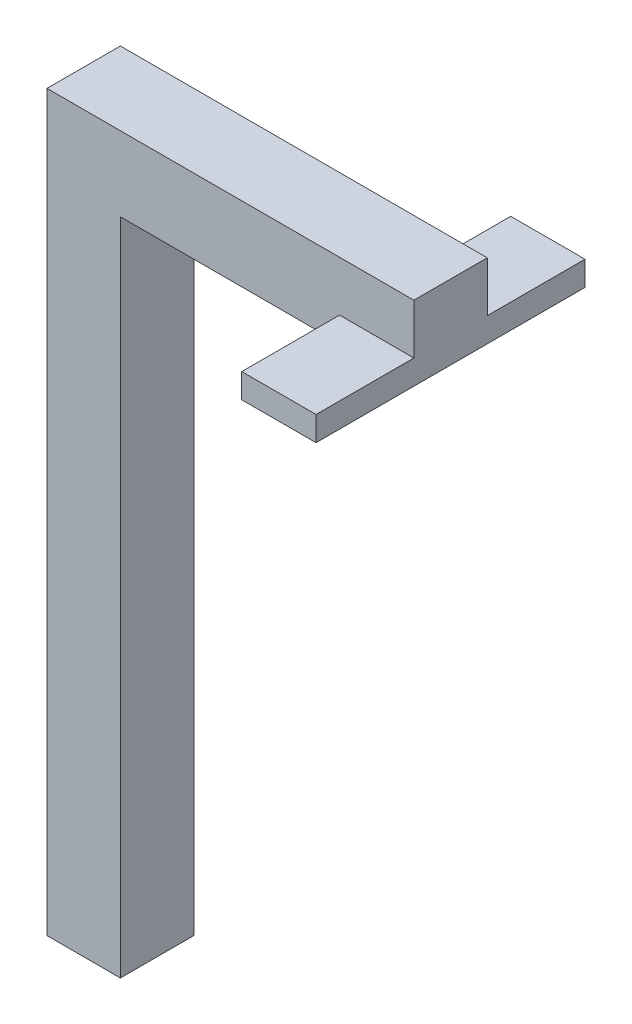
ISO-10303-21;
HEADER;
FILE_DESCRIPTION(('STEP AP214'),'2;1');
FILE_NAME('part.step','',(''),(''),'','','');
FILE_SCHEMA(('AUTOMOTIVE_DESIGN { 1 0 10303 214 1 1 1 1 }'));
ENDSEC;
DATA;
#1=APPLICATION_CONTEXT('core data for automotive mechanical design processes');
#2=APPLICATION_PROTOCOL_DEFINITION('international standard','automotive_design',2000,#1);
#3=PRODUCT_CONTEXT('',#1,'mechanical');
#4=PRODUCT('Part','Part','',(#3));
#5=PRODUCT_RELATED_PRODUCT_CATEGORY('part','',(#4));
#6=PRODUCT_DEFINITION_FORMATION('','',#4);
#7=PRODUCT_DEFINITION_CONTEXT('part definition',#1,'design');
#8=PRODUCT_DEFINITION('design','',#6,#7);
#9=PRODUCT_DEFINITION_SHAPE('','',#8);
#10=(LENGTH_UNIT() NAMED_UNIT(*) SI_UNIT(.MILLI.,.METRE.));
#11=(NAMED_UNIT(*) PLANE_ANGLE_UNIT() SI_UNIT($,.RADIAN.));
#12=(NAMED_UNIT(*) SI_UNIT($,.STERADIAN.) SOLID_ANGLE_UNIT());
#13=UNCERTAINTY_MEASURE_WITH_UNIT(LENGTH_MEASURE(1.E-05),#10,'distance_accuracy_value','');
#14=(GEOMETRIC_REPRESENTATION_CONTEXT(3) GLOBAL_UNCERTAINTY_ASSIGNED_CONTEXT((#13)) GLOBAL_UNIT_ASSIGNED_CONTEXT((#10,
#11,#12)) REPRESENTATION_CONTEXT('',''));
#15=CARTESIAN_POINT('',(0.,0.,0.));
#16=DIRECTION('',(0.,0.,1.));
#17=DIRECTION('',(1.,0.,0.));
#18=AXIS2_PLACEMENT_3D('',#15,#16,#17);
#19=CARTESIAN_POINT('',(7.62,0.,7.62));
#20=DIRECTION('',(-1.,0.,0.));
#21=DIRECTION('',(0.,0.,1.));
#22=AXIS2_PLACEMENT_3D('',#19,#20,#21);
#23=PLANE('',#22);
#24=DIRECTION('',(0.,0.,-1.));
#25=VECTOR('',#24,1.);
#26=CARTESIAN_POINT('',(7.62,68.4598354175392,0.));
#27=LINE('',#26,#25);
#28=CARTESIAN_POINT('',(7.62,68.4598354175391,7.62));
#29=VERTEX_POINT('',#28);
#30=CARTESIAN_POINT('',(7.62,68.4598354175392,0.));
#31=VERTEX_POINT('',#30);
#32=EDGE_CURVE('E182',#29,#31,#27,.T.);
#33=ORIENTED_EDGE('',*,*,#32,.F.);
#34=DIRECTION('',(0.,1.,0.));
#35=VECTOR('',#34,1.);
#36=CARTESIAN_POINT('',(7.62,0.,7.62));
#37=LINE('',#36,#35);
#38=CARTESIAN_POINT('',(7.62,0.,7.62));
#39=VERTEX_POINT('',#38);
#40=EDGE_CURVE('E203',#39,#29,#37,.T.);
#41=ORIENTED_EDGE('',*,*,#40,.F.);
#42=DIRECTION('',(0.,0.,-1.));
#43=VECTOR('',#42,1.);
#44=CARTESIAN_POINT('',(7.62,0.,7.62));
#45=LINE('',#44,#43);
#46=CARTESIAN_POINT('',(7.62,0.,0.));
#47=VERTEX_POINT('',#46);
#48=EDGE_CURVE('E47',#39,#47,#45,.T.);
#49=ORIENTED_EDGE('',*,*,#48,.T.);
#50=DIRECTION('',(0.,1.,0.));
#51=VECTOR('',#50,1.);
#52=CARTESIAN_POINT('',(7.62,0.,0.));
#53=LINE('',#52,#51);
#54=EDGE_CURVE('E213',#47,#31,#53,.T.);
#55=ORIENTED_EDGE('',*,*,#54,.T.);
#56=EDGE_LOOP('',(#33,#41,#49,#55));
#57=FACE_BOUND('',#56,.T.);
#58=ADVANCED_FACE('F39',(#57),#23,.F.);
#59=CARTESIAN_POINT('',(0.,76.2,7.62));
#60=DIRECTION('',(1.,0.,0.));
#61=DIRECTION('',(0.,0.,-1.));
#62=AXIS2_PLACEMENT_3D('',#59,#60,#61);
#63=PLANE('',#62);
#64=DIRECTION('',(0.,-1.,0.));
#65=VECTOR('',#64,1.);
#66=CARTESIAN_POINT('',(0.,76.2,0.));
#67=LINE('',#66,#65);
#68=CARTESIAN_POINT('',(0.,76.2,0.));
#69=VERTEX_POINT('',#68);
#70=CARTESIAN_POINT('',(0.,0.,0.));
#71=VERTEX_POINT('',#70);
#72=EDGE_CURVE('E196',#69,#71,#67,.T.);
#73=ORIENTED_EDGE('',*,*,#72,.T.);
#74=DIRECTION('',(0.,0.,-1.));
#75=VECTOR('',#74,1.);
#76=CARTESIAN_POINT('',(0.,0.,7.62));
#77=LINE('',#76,#75);
#78=CARTESIAN_POINT('',(0.,0.,7.62));
#79=VERTEX_POINT('',#78);
#80=EDGE_CURVE('E11',#79,#71,#77,.T.);
#81=ORIENTED_EDGE('',*,*,#80,.F.);
#82=DIRECTION('',(0.,-1.,0.));
#83=VECTOR('',#82,1.);
#84=CARTESIAN_POINT('',(0.,76.2,7.62));
#85=LINE('',#84,#83);
#86=CARTESIAN_POINT('',(0.,76.2,7.62));
#87=VERTEX_POINT('',#86);
#88=EDGE_CURVE('E197',#87,#79,#85,.T.);
#89=ORIENTED_EDGE('',*,*,#88,.F.);
#90=DIRECTION('',(0.,0.,-1.));
#91=VECTOR('',#90,1.);
#92=CARTESIAN_POINT('',(0.,76.2,7.62));
#93=LINE('',#92,#91);
#94=EDGE_CURVE('E208',#87,#69,#93,.T.);
#95=ORIENTED_EDGE('',*,*,#94,.T.);
#96=EDGE_LOOP('',(#73,#81,#89,#95));
#97=FACE_BOUND('',#96,.T.);
#98=ADVANCED_FACE('F41',(#97),#63,.F.);
#99=CARTESIAN_POINT('',(0.,0.,7.62));
#100=DIRECTION('',(0.,1.,0.));
#101=DIRECTION('',(0.,0.,1.));
#102=AXIS2_PLACEMENT_3D('',#99,#100,#101);
#103=PLANE('',#102);
#104=DIRECTION('',(1.,0.,0.));
#105=VECTOR('',#104,1.);
#106=CARTESIAN_POINT('',(0.,0.,0.));
#107=LINE('',#106,#105);
#108=EDGE_CURVE('E211',#71,#47,#107,.T.);
#109=ORIENTED_EDGE('',*,*,#108,.T.);
#110=ORIENTED_EDGE('',*,*,#48,.F.);
#111=DIRECTION('',(1.,0.,0.));
#112=VECTOR('',#111,1.);
#113=CARTESIAN_POINT('',(0.,0.,7.62));
#114=LINE('',#113,#112);
#115=EDGE_CURVE('E200',#79,#39,#114,.T.);
#116=ORIENTED_EDGE('',*,*,#115,.F.);
#117=ORIENTED_EDGE('',*,*,#80,.T.);
#118=EDGE_LOOP('',(#109,#110,#116,#117));
#119=FACE_BOUND('',#118,.T.);
#120=ADVANCED_FACE('F235',(#119),#103,.F.);
#121=CARTESIAN_POINT('',(7.62,76.2,7.62));
#122=DIRECTION('',(0.,-1.,0.));
#123=DIRECTION('',(0.,0.,-1.));
#124=AXIS2_PLACEMENT_3D('',#121,#122,#123);
#125=PLANE('',#124);
#126=DIRECTION('',(-1.,0.,0.));
#127=VECTOR('',#126,1.);
#128=CARTESIAN_POINT('',(7.62,76.2,0.));
#129=LINE('',#128,#127);
#130=CARTESIAN_POINT('',(38.1,76.2,0.));
#131=VERTEX_POINT('',#130);
#132=EDGE_CURVE('E201',#131,#69,#129,.T.);
#133=ORIENTED_EDGE('',*,*,#132,.T.);
#134=ORIENTED_EDGE('',*,*,#94,.F.);
#135=DIRECTION('',(-1.,0.,0.));
#136=VECTOR('',#135,1.);
#137=CARTESIAN_POINT('',(7.62,76.2,7.62));
#138=LINE('',#137,#136);
#139=CARTESIAN_POINT('',(38.1,76.2,7.62));
#140=VERTEX_POINT('',#139);
#141=EDGE_CURVE('E206',#140,#87,#138,.T.);
#142=ORIENTED_EDGE('',*,*,#141,.F.);
#143=DIRECTION('',(0.,0.,1.));
#144=VECTOR('',#143,1.);
#145=CARTESIAN_POINT('',(38.1,76.2,7.62));
#146=LINE('',#145,#144);
#147=EDGE_CURVE('E183',#131,#140,#146,.T.);
#148=ORIENTED_EDGE('',*,*,#147,.F.);
#149=EDGE_LOOP('',(#133,#134,#142,#148));
#150=FACE_BOUND('',#149,.T.);
#151=ADVANCED_FACE('F241',(#150),#125,.F.);
#152=CARTESIAN_POINT('',(0.,0.,7.62));
#153=DIRECTION('',(0.,0.,1.));
#154=DIRECTION('',(1.,0.,0.));
#155=AXIS2_PLACEMENT_3D('',#152,#153,#154);
#156=PLANE('',#155);
#157=DIRECTION('',(0.,-1.,0.));
#158=VECTOR('',#157,1.);
#159=CARTESIAN_POINT('',(30.3825770628841,0.,7.62));
#160=LINE('',#159,#158);
#161=CARTESIAN_POINT('',(30.3825770628841,70.9998354175392,7.62));
#162=VERTEX_POINT('',#161);
#163=CARTESIAN_POINT('',(30.3825770628841,68.4598354175392,7.62));
#164=VERTEX_POINT('',#163);
#165=EDGE_CURVE('E180',#162,#164,#160,.T.);
#166=ORIENTED_EDGE('',*,*,#165,.F.);
#167=DIRECTION('',(-1.,0.,0.));
#168=VECTOR('',#167,1.);
#169=CARTESIAN_POINT('',(0.,70.9998354175392,7.62));
#170=LINE('',#169,#168);
#171=CARTESIAN_POINT('',(38.1,70.9998354175392,7.62));
#172=VERTEX_POINT('',#171);
#173=EDGE_CURVE('E176',#172,#162,#170,.T.);
#174=ORIENTED_EDGE('',*,*,#173,.F.);
#175=DIRECTION('',(0.,-1.,0.));
#176=VECTOR('',#175,1.);
#177=CARTESIAN_POINT('',(38.1,68.4598354175392,7.62));
#178=LINE('',#177,#176);
#179=EDGE_CURVE('E137',#140,#172,#178,.T.);
#180=ORIENTED_EDGE('',*,*,#179,.F.);
#181=ORIENTED_EDGE('',*,*,#141,.T.);
#182=ORIENTED_EDGE('',*,*,#88,.T.);
#183=ORIENTED_EDGE('',*,*,#115,.T.);
#184=ORIENTED_EDGE('',*,*,#40,.T.);
#185=DIRECTION('',(-1.,0.,0.));
#186=VECTOR('',#185,1.);
#187=CARTESIAN_POINT('',(38.1,68.4598354175392,7.62));
#188=LINE('',#187,#186);
#189=EDGE_CURVE('E194',#164,#29,#188,.T.);
#190=ORIENTED_EDGE('',*,*,#189,.F.);
#191=EDGE_LOOP('',(#166,#174,#180,#181,#182,#183,#184,#190));
#192=FACE_BOUND('',#191,.T.);
#193=ADVANCED_FACE('F232',(#192),#156,.T.);
#194=CARTESIAN_POINT('',(0.,0.,0.));
#195=DIRECTION('',(0.,0.,1.));
#196=DIRECTION('',(1.,0.,0.));
#197=AXIS2_PLACEMENT_3D('',#194,#195,#196);
#198=PLANE('',#197);
#199=DIRECTION('',(-1.,0.,0.));
#200=VECTOR('',#199,1.);
#201=CARTESIAN_POINT('',(0.,70.9998354175392,0.));
#202=LINE('',#201,#200);
#203=CARTESIAN_POINT('',(38.1,70.9998354175392,0.));
#204=VERTEX_POINT('',#203);
#205=CARTESIAN_POINT('',(30.3825770628841,70.9998354175392,0.));
#206=VERTEX_POINT('',#205);
#207=EDGE_CURVE('E54',#204,#206,#202,.T.);
#208=ORIENTED_EDGE('',*,*,#207,.T.);
#209=DIRECTION('',(0.,-1.,0.));
#210=VECTOR('',#209,1.);
#211=CARTESIAN_POINT('',(30.3825770628841,0.,0.));
#212=LINE('',#211,#210);
#213=CARTESIAN_POINT('',(30.3825770628841,68.4598354175392,0.));
#214=VERTEX_POINT('',#213);
#215=EDGE_CURVE('E178',#206,#214,#212,.T.);
#216=ORIENTED_EDGE('',*,*,#215,.T.);
#217=DIRECTION('',(-1.,0.,0.));
#218=VECTOR('',#217,1.);
#219=CARTESIAN_POINT('',(38.1,68.4598354175392,0.));
#220=LINE('',#219,#218);
#221=EDGE_CURVE('E190',#214,#31,#220,.T.);
#222=ORIENTED_EDGE('',*,*,#221,.T.);
#223=ORIENTED_EDGE('',*,*,#54,.F.);
#224=ORIENTED_EDGE('',*,*,#108,.F.);
#225=ORIENTED_EDGE('',*,*,#72,.F.);
#226=ORIENTED_EDGE('',*,*,#132,.F.);
#227=DIRECTION('',(0.,1.,0.));
#228=VECTOR('',#227,1.);
#229=CARTESIAN_POINT('',(38.1,76.2,0.));
#230=LINE('',#229,#228);
#231=EDGE_CURVE('E188',#204,#131,#230,.T.);
#232=ORIENTED_EDGE('',*,*,#231,.F.);
#233=EDGE_LOOP('',(#208,#216,#222,#223,#224,#225,#226,#232));
#234=FACE_BOUND('',#233,.T.);
#235=ADVANCED_FACE('F225',(#234),#198,.F.);
#236=CARTESIAN_POINT('',(38.1,68.4598354175392,0.));
#237=DIRECTION('',(0.,1.,0.));
#238=DIRECTION('',(0.,0.,1.));
#239=AXIS2_PLACEMENT_3D('',#236,#237,#238);
#240=PLANE('',#239);
#241=ORIENTED_EDGE('',*,*,#221,.F.);
#242=DIRECTION('',(0.,0.,-1.));
#243=VECTOR('',#242,1.);
#244=CARTESIAN_POINT('',(30.3825770628841,68.4598354175392,-10.1506554041903));
#245=LINE('',#244,#243);
#246=CARTESIAN_POINT('',(30.3825770628841,68.4598354175392,-10.1506554041903));
#247=VERTEX_POINT('',#246);
#248=EDGE_CURVE('E164',#214,#247,#245,.T.);
#249=ORIENTED_EDGE('',*,*,#248,.T.);
#250=DIRECTION('',(1.,0.,0.));
#251=VECTOR('',#250,1.);
#252=CARTESIAN_POINT('',(38.1,68.4598354175392,-10.1506554041903));
#253=LINE('',#252,#251);
#254=CARTESIAN_POINT('',(38.1,68.4598354175392,-10.1506554041903));
#255=VERTEX_POINT('',#254);
#256=EDGE_CURVE('E142',#247,#255,#253,.T.);
#257=ORIENTED_EDGE('',*,*,#256,.T.);
#258=DIRECTION('',(0.,0.,-1.));
#259=VECTOR('',#258,1.);
#260=CARTESIAN_POINT('',(38.1,68.4598354175392,0.));
#261=LINE('',#260,#259);
#262=CARTESIAN_POINT('',(38.1,68.4598354175392,17.78));
#263=VERTEX_POINT('',#262);
#264=EDGE_CURVE('E186',#263,#255,#261,.T.);
#265=ORIENTED_EDGE('',*,*,#264,.F.);
#266=DIRECTION('',(-1.,0.,0.));
#267=VECTOR('',#266,1.);
#268=CARTESIAN_POINT('',(30.3825770628841,68.4598354175392,17.78));
#269=LINE('',#268,#267);
#270=CARTESIAN_POINT('',(30.3825770628841,68.4598354175392,17.78));
#271=VERTEX_POINT('',#270);
#272=EDGE_CURVE('E148',#263,#271,#269,.T.);
#273=ORIENTED_EDGE('',*,*,#272,.T.);
#274=EDGE_CURVE('E62',#271,#164,#245,.T.);
#275=ORIENTED_EDGE('',*,*,#274,.T.);
#276=ORIENTED_EDGE('',*,*,#189,.T.);
#277=ORIENTED_EDGE('',*,*,#32,.T.);
#278=EDGE_LOOP('',(#241,#249,#257,#265,#273,#275,#276,#277));
#279=FACE_BOUND('',#278,.T.);
#280=ADVANCED_FACE('F228',(#279),#240,.F.);
#281=CARTESIAN_POINT('',(38.1,0.,0.));
#282=DIRECTION('',(-1.,0.,0.));
#283=DIRECTION('',(0.,0.,1.));
#284=AXIS2_PLACEMENT_3D('',#281,#282,#283);
#285=PLANE('',#284);
#286=ORIENTED_EDGE('',*,*,#179,.T.);
#287=DIRECTION('',(0.,0.,1.));
#288=VECTOR('',#287,1.);
#289=CARTESIAN_POINT('',(38.1,70.9998354175392,7.62));
#290=LINE('',#289,#288);
#291=CARTESIAN_POINT('',(38.1,70.9998354175392,17.78));
#292=VERTEX_POINT('',#291);
#293=EDGE_CURVE('E130',#172,#292,#290,.T.);
#294=ORIENTED_EDGE('',*,*,#293,.T.);
#295=DIRECTION('',(0.,-1.,0.));
#296=VECTOR('',#295,1.);
#297=CARTESIAN_POINT('',(38.1,70.9998354175392,17.78));
#298=LINE('',#297,#296);
#299=EDGE_CURVE('E133',#292,#263,#298,.T.);
#300=ORIENTED_EDGE('',*,*,#299,.T.);
#301=ORIENTED_EDGE('',*,*,#264,.T.);
#302=DIRECTION('',(0.,-1.,0.));
#303=VECTOR('',#302,1.);
#304=CARTESIAN_POINT('',(38.1,70.9998354175392,-10.1506554041903));
#305=LINE('',#304,#303);
#306=CARTESIAN_POINT('',(38.1,70.9998354175392,-10.1506554041903));
#307=VERTEX_POINT('',#306);
#308=EDGE_CURVE('E168',#307,#255,#305,.T.);
#309=ORIENTED_EDGE('',*,*,#308,.F.);
#310=EDGE_CURVE('E141',#307,#204,#290,.T.);
#311=ORIENTED_EDGE('',*,*,#310,.T.);
#312=ORIENTED_EDGE('',*,*,#231,.T.);
#313=ORIENTED_EDGE('',*,*,#147,.T.);
#314=EDGE_LOOP('',(#286,#294,#300,#301,#309,#311,#312,#313));
#315=FACE_BOUND('',#314,.T.);
#316=ADVANCED_FACE('F132',(#315),#285,.F.);
#317=CARTESIAN_POINT('',(38.1,70.9998354175392,-10.1506554041903));
#318=DIRECTION('',(0.,0.,-1.));
#319=DIRECTION('',(0.,1.,0.));
#320=AXIS2_PLACEMENT_3D('',#317,#318,#319);
#321=PLANE('',#320);
#322=ORIENTED_EDGE('',*,*,#256,.F.);
#323=DIRECTION('',(0.,-1.,0.));
#324=VECTOR('',#323,1.);
#325=CARTESIAN_POINT('',(30.3825770628841,70.9998354175392,-10.1506554041903));
#326=LINE('',#325,#324);
#327=CARTESIAN_POINT('',(30.3825770628841,70.9998354175392,-10.1506554041903));
#328=VERTEX_POINT('',#327);
#329=EDGE_CURVE('E171',#328,#247,#326,.T.);
#330=ORIENTED_EDGE('',*,*,#329,.F.);
#331=DIRECTION('',(1.,0.,0.));
#332=VECTOR('',#331,1.);
#333=CARTESIAN_POINT('',(38.1,70.9998354175392,-10.1506554041903));
#334=LINE('',#333,#332);
#335=EDGE_CURVE('E150',#328,#307,#334,.T.);
#336=ORIENTED_EDGE('',*,*,#335,.T.);
#337=ORIENTED_EDGE('',*,*,#308,.T.);
#338=EDGE_LOOP('',(#322,#330,#336,#337));
#339=FACE_BOUND('',#338,.T.);
#340=ADVANCED_FACE('F252',(#339),#321,.T.);
#341=CARTESIAN_POINT('',(0.,70.9998354175392,1.29307171957265E-13));
#342=DIRECTION('',(0.,1.,0.));
#343=DIRECTION('',(0.,0.,1.));
#344=AXIS2_PLACEMENT_3D('',#341,#342,#343);
#345=PLANE('',#344);
#346=ORIENTED_EDGE('',*,*,#207,.F.);
#347=ORIENTED_EDGE('',*,*,#310,.F.);
#348=ORIENTED_EDGE('',*,*,#335,.F.);
#349=DIRECTION('',(0.,0.,-1.));
#350=VECTOR('',#349,1.);
#351=CARTESIAN_POINT('',(30.3825770628841,70.9998354175392,-10.1506554041903));
#352=LINE('',#351,#350);
#353=EDGE_CURVE('E156',#206,#328,#352,.T.);
#354=ORIENTED_EDGE('',*,*,#353,.F.);
#355=EDGE_LOOP('',(#346,#347,#348,#354));
#356=FACE_BOUND('',#355,.T.);
#357=ADVANCED_FACE('F245',(#356),#345,.T.);
#358=CARTESIAN_POINT('',(30.3825770628841,70.9998354175392,-10.1506554041903));
#359=DIRECTION('',(-1.,0.,0.));
#360=DIRECTION('',(0.,0.,1.));
#361=AXIS2_PLACEMENT_3D('',#358,#359,#360);
#362=PLANE('',#361);
#363=ORIENTED_EDGE('',*,*,#215,.F.);
#364=ORIENTED_EDGE('',*,*,#353,.T.);
#365=ORIENTED_EDGE('',*,*,#329,.T.);
#366=ORIENTED_EDGE('',*,*,#248,.F.);
#367=EDGE_LOOP('',(#363,#364,#365,#366));
#368=FACE_BOUND('',#367,.T.);
#369=ADVANCED_FACE('F249',(#368),#362,.T.);
#370=CARTESIAN_POINT('',(30.3825770628841,70.9998354175392,17.78));
#371=VERTEX_POINT('',#370);
#372=EDGE_CURVE('E155',#371,#162,#352,.T.);
#373=ORIENTED_EDGE('',*,*,#372,.T.);
#374=ORIENTED_EDGE('',*,*,#165,.T.);
#375=ORIENTED_EDGE('',*,*,#274,.F.);
#376=DIRECTION('',(0.,-1.,0.));
#377=VECTOR('',#376,1.);
#378=CARTESIAN_POINT('',(30.3825770628841,70.9998354175392,17.78));
#379=LINE('',#378,#377);
#380=EDGE_CURVE('E149',#371,#271,#379,.T.);
#381=ORIENTED_EDGE('',*,*,#380,.F.);
#382=EDGE_LOOP('',(#373,#374,#375,#381));
#383=FACE_BOUND('',#382,.T.);
#384=ADVANCED_FACE('F284',(#383),#362,.T.);
#385=CARTESIAN_POINT('',(30.3825770628841,70.9998354175392,17.78));
#386=DIRECTION('',(0.,0.,1.));
#387=DIRECTION('',(0.,-1.,0.));
#388=AXIS2_PLACEMENT_3D('',#385,#386,#387);
#389=PLANE('',#388);
#390=ORIENTED_EDGE('',*,*,#272,.F.);
#391=ORIENTED_EDGE('',*,*,#299,.F.);
#392=DIRECTION('',(-1.,0.,0.));
#393=VECTOR('',#392,1.);
#394=CARTESIAN_POINT('',(30.3825770628841,70.9998354175392,17.78));
#395=LINE('',#394,#393);
#396=EDGE_CURVE('E147',#292,#371,#395,.T.);
#397=ORIENTED_EDGE('',*,*,#396,.T.);
#398=ORIENTED_EDGE('',*,*,#380,.T.);
#399=EDGE_LOOP('',(#390,#391,#397,#398));
#400=FACE_BOUND('',#399,.T.);
#401=ADVANCED_FACE('F146',(#400),#389,.T.);
#402=ORIENTED_EDGE('',*,*,#293,.F.);
#403=ORIENTED_EDGE('',*,*,#173,.T.);
#404=ORIENTED_EDGE('',*,*,#372,.F.);
#405=ORIENTED_EDGE('',*,*,#396,.F.);
#406=EDGE_LOOP('',(#402,#403,#404,#405));
#407=FACE_BOUND('',#406,.T.);
#408=ADVANCED_FACE('F153',(#407),#345,.T.);
#409=CLOSED_SHELL('',(#58,#98,#120,#151,#193,#235,#280,#316,#340,#357,#369,#384,#401,#408));
#410=MANIFOLD_SOLID_BREP('B2',#409);
#411=ADVANCED_BREP_SHAPE_REPRESENTATION('',(#18,#410),#14);
#412=SHAPE_DEFINITION_REPRESENTATION(#9,#411);
ENDSEC;
END-ISO-10303-21;
